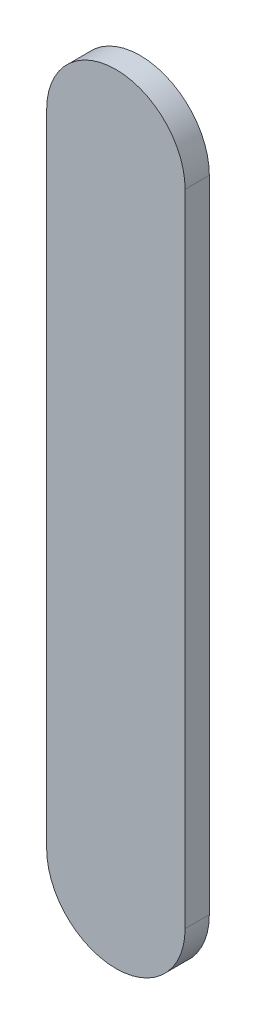
ISO-10303-21;
HEADER;
FILE_DESCRIPTION(('STEP AP214'),'2;1');
FILE_NAME('part.step','',(''),(''),'','','');
FILE_SCHEMA(('AUTOMOTIVE_DESIGN { 1 0 10303 214 1 1 1 1 }'));
ENDSEC;
DATA;
#1=APPLICATION_CONTEXT('core data for automotive mechanical design processes');
#2=APPLICATION_PROTOCOL_DEFINITION('international standard','automotive_design',2000,#1);
#3=PRODUCT_CONTEXT('',#1,'mechanical');
#4=PRODUCT('Part','Part','',(#3));
#5=PRODUCT_RELATED_PRODUCT_CATEGORY('part','',(#4));
#6=PRODUCT_DEFINITION_FORMATION('','',#4);
#7=PRODUCT_DEFINITION_CONTEXT('part definition',#1,'design');
#8=PRODUCT_DEFINITION('design','',#6,#7);
#9=PRODUCT_DEFINITION_SHAPE('','',#8);
#10=(LENGTH_UNIT() NAMED_UNIT(*) SI_UNIT(.MILLI.,.METRE.));
#11=(NAMED_UNIT(*) PLANE_ANGLE_UNIT() SI_UNIT($,.RADIAN.));
#12=(NAMED_UNIT(*) SI_UNIT($,.STERADIAN.) SOLID_ANGLE_UNIT());
#13=UNCERTAINTY_MEASURE_WITH_UNIT(LENGTH_MEASURE(1.E-05),#10,'distance_accuracy_value','');
#14=(GEOMETRIC_REPRESENTATION_CONTEXT(3) GLOBAL_UNCERTAINTY_ASSIGNED_CONTEXT((#13)) GLOBAL_UNIT_ASSIGNED_CONTEXT((#10,
#11,#12)) REPRESENTATION_CONTEXT('',''));
#15=CARTESIAN_POINT('',(0.,0.,0.));
#16=DIRECTION('',(0.,0.,1.));
#17=DIRECTION('',(1.,0.,0.));
#18=AXIS2_PLACEMENT_3D('',#15,#16,#17);
#19=CARTESIAN_POINT('',(83.6,-131.365,1.635));
#20=DIRECTION('',(0.,0.,1.));
#21=DIRECTION('',(1.,0.,0.));
#22=AXIS2_PLACEMENT_3D('',#19,#20,#21);
#23=PLANE('',#22);
#24=DIRECTION('',(0.,-1.,0.));
#25=VECTOR('',#24,1.);
#26=CARTESIAN_POINT('',(83.6,-131.365,1.635));
#27=LINE('',#26,#25);
#28=CARTESIAN_POINT('',(83.6,-131.365,1.635));
#29=VERTEX_POINT('',#28);
#30=CARTESIAN_POINT('',(83.6,-132.29,1.635));
#31=VERTEX_POINT('',#30);
#32=EDGE_CURVE('E67',#29,#31,#27,.T.);
#33=ORIENTED_EDGE('',*,*,#32,.T.);
#34=CARTESIAN_POINT('',(83.7,-132.29,1.635));
#35=DIRECTION('',(0.,0.,1.));
#36=DIRECTION('',(-1.,-2.84217094304E-13,0.));
#37=AXIS2_PLACEMENT_3D('',#34,#35,#36);
#38=CIRCLE('',#37,0.1);
#39=CARTESIAN_POINT('',(83.8,-132.29,1.635));
#40=VERTEX_POINT('',#39);
#41=EDGE_CURVE('E102',#31,#40,#38,.T.);
#42=ORIENTED_EDGE('',*,*,#41,.T.);
#43=DIRECTION('',(0.,1.,0.));
#44=VECTOR('',#43,1.);
#45=CARTESIAN_POINT('',(83.8,-132.29,1.635));
#46=LINE('',#45,#44);
#47=CARTESIAN_POINT('',(83.8,-131.365,1.635));
#48=VERTEX_POINT('',#47);
#49=EDGE_CURVE('E70',#40,#48,#46,.T.);
#50=ORIENTED_EDGE('',*,*,#49,.T.);
#51=CARTESIAN_POINT('',(83.7,-131.365,1.635));
#52=DIRECTION('',(0.,0.,1.));
#53=DIRECTION('',(1.,-2.842170943041E-13,0.));
#54=AXIS2_PLACEMENT_3D('',#51,#52,#53);
#55=CIRCLE('',#54,0.1);
#56=EDGE_CURVE('E11',#48,#29,#55,.T.);
#57=ORIENTED_EDGE('',*,*,#56,.T.);
#58=EDGE_LOOP('',(#33,#42,#50,#57));
#59=FACE_BOUND('',#58,.T.);
#60=ADVANCED_FACE('F17',(#59),#23,.T.);
#61=CARTESIAN_POINT('',(83.6,-131.365,1.6));
#62=DIRECTION('',(0.,0.,1.));
#63=DIRECTION('',(1.,0.,0.));
#64=AXIS2_PLACEMENT_3D('',#61,#62,#63);
#65=PLANE('',#64);
#66=CARTESIAN_POINT('',(83.7,-131.365,1.6));
#67=DIRECTION('',(0.,0.,1.));
#68=DIRECTION('',(1.,-2.842170943041E-13,0.));
#69=AXIS2_PLACEMENT_3D('',#66,#67,#68);
#70=CIRCLE('',#69,0.1);
#71=CARTESIAN_POINT('',(83.8,-131.365,1.6));
#72=VERTEX_POINT('',#71);
#73=CARTESIAN_POINT('',(83.6,-131.365,1.6));
#74=VERTEX_POINT('',#73);
#75=EDGE_CURVE('E21',#72,#74,#70,.T.);
#76=ORIENTED_EDGE('',*,*,#75,.F.);
#77=DIRECTION('',(0.,1.,0.));
#78=VECTOR('',#77,1.);
#79=CARTESIAN_POINT('',(83.8,-132.29,1.6));
#80=LINE('',#79,#78);
#81=CARTESIAN_POINT('',(83.8,-132.29,1.6));
#82=VERTEX_POINT('',#81);
#83=EDGE_CURVE('E97',#82,#72,#80,.T.);
#84=ORIENTED_EDGE('',*,*,#83,.F.);
#85=CARTESIAN_POINT('',(83.7,-132.29,1.6));
#86=DIRECTION('',(0.,0.,1.));
#87=DIRECTION('',(-1.,-2.84217094304E-13,0.));
#88=AXIS2_PLACEMENT_3D('',#85,#86,#87);
#89=CIRCLE('',#88,0.1);
#90=CARTESIAN_POINT('',(83.6,-132.29,1.6));
#91=VERTEX_POINT('',#90);
#92=EDGE_CURVE('E79',#91,#82,#89,.T.);
#93=ORIENTED_EDGE('',*,*,#92,.F.);
#94=DIRECTION('',(0.,-1.,0.));
#95=VECTOR('',#94,1.);
#96=CARTESIAN_POINT('',(83.6,-131.365,1.6));
#97=LINE('',#96,#95);
#98=EDGE_CURVE('E90',#74,#91,#97,.T.);
#99=ORIENTED_EDGE('',*,*,#98,.F.);
#100=EDGE_LOOP('',(#76,#84,#93,#99));
#101=FACE_BOUND('',#100,.T.);
#102=ADVANCED_FACE('F19',(#101),#65,.F.);
#103=CARTESIAN_POINT('',(83.7,-131.365,1.6));
#104=DIRECTION('',(0.,0.,-1.));
#105=DIRECTION('',(1.,-2.842170943041E-13,0.));
#106=AXIS2_PLACEMENT_3D('',#103,#104,#105);
#107=CYLINDRICAL_SURFACE('',#106,0.1);
#108=ORIENTED_EDGE('',*,*,#75,.T.);
#109=DIRECTION('',(0.,0.,1.));
#110=VECTOR('',#109,1.);
#111=CARTESIAN_POINT('',(83.6,-131.365,1.6));
#112=LINE('',#111,#110);
#113=EDGE_CURVE('E73',#74,#29,#112,.T.);
#114=ORIENTED_EDGE('',*,*,#113,.T.);
#115=ORIENTED_EDGE('',*,*,#56,.F.);
#116=DIRECTION('',(0.,0.,1.));
#117=VECTOR('',#116,1.);
#118=CARTESIAN_POINT('',(83.8,-131.365,1.6));
#119=LINE('',#118,#117);
#120=EDGE_CURVE('E101',#72,#48,#119,.T.);
#121=ORIENTED_EDGE('',*,*,#120,.F.);
#122=EDGE_LOOP('',(#108,#114,#115,#121));
#123=FACE_BOUND('',#122,.T.);
#124=ADVANCED_FACE('F74',(#123),#107,.T.);
#125=CARTESIAN_POINT('',(83.8,-132.29,1.6));
#126=DIRECTION('',(-1.,0.,0.));
#127=DIRECTION('',(0.,0.,1.));
#128=AXIS2_PLACEMENT_3D('',#125,#126,#127);
#129=PLANE('',#128);
#130=ORIENTED_EDGE('',*,*,#83,.T.);
#131=ORIENTED_EDGE('',*,*,#120,.T.);
#132=ORIENTED_EDGE('',*,*,#49,.F.);
#133=DIRECTION('',(0.,0.,1.));
#134=VECTOR('',#133,1.);
#135=CARTESIAN_POINT('',(83.8,-132.29,1.6));
#136=LINE('',#135,#134);
#137=EDGE_CURVE('E96',#82,#40,#136,.T.);
#138=ORIENTED_EDGE('',*,*,#137,.F.);
#139=EDGE_LOOP('',(#130,#131,#132,#138));
#140=FACE_BOUND('',#139,.T.);
#141=ADVANCED_FACE('F133',(#140),#129,.F.);
#142=CARTESIAN_POINT('',(83.7,-132.29,1.6));
#143=DIRECTION('',(0.,0.,-1.));
#144=DIRECTION('',(-1.,-2.84217094304E-13,0.));
#145=AXIS2_PLACEMENT_3D('',#142,#143,#144);
#146=CYLINDRICAL_SURFACE('',#145,0.1);
#147=ORIENTED_EDGE('',*,*,#92,.T.);
#148=ORIENTED_EDGE('',*,*,#137,.T.);
#149=ORIENTED_EDGE('',*,*,#41,.F.);
#150=DIRECTION('',(0.,0.,1.));
#151=VECTOR('',#150,1.);
#152=CARTESIAN_POINT('',(83.6,-132.29,1.6));
#153=LINE('',#152,#151);
#154=EDGE_CURVE('E83',#91,#31,#153,.T.);
#155=ORIENTED_EDGE('',*,*,#154,.F.);
#156=EDGE_LOOP('',(#147,#148,#149,#155));
#157=FACE_BOUND('',#156,.T.);
#158=ADVANCED_FACE('F122',(#157),#146,.T.);
#159=CARTESIAN_POINT('',(83.6,-131.365,1.6));
#160=DIRECTION('',(1.,0.,0.));
#161=DIRECTION('',(0.,1.,0.));
#162=AXIS2_PLACEMENT_3D('',#159,#160,#161);
#163=PLANE('',#162);
#164=ORIENTED_EDGE('',*,*,#98,.T.);
#165=ORIENTED_EDGE('',*,*,#154,.T.);
#166=ORIENTED_EDGE('',*,*,#32,.F.);
#167=ORIENTED_EDGE('',*,*,#113,.F.);
#168=EDGE_LOOP('',(#164,#165,#166,#167));
#169=FACE_BOUND('',#168,.T.);
#170=ADVANCED_FACE('F81',(#169),#163,.F.);
#171=CLOSED_SHELL('',(#60,#102,#124,#141,#158,#170));
#172=MANIFOLD_SOLID_BREP('B1',#171);
#173=ADVANCED_BREP_SHAPE_REPRESENTATION('',(#18,#172),#14);
#174=SHAPE_DEFINITION_REPRESENTATION(#9,#173);
ENDSEC;
END-ISO-10303-21;
